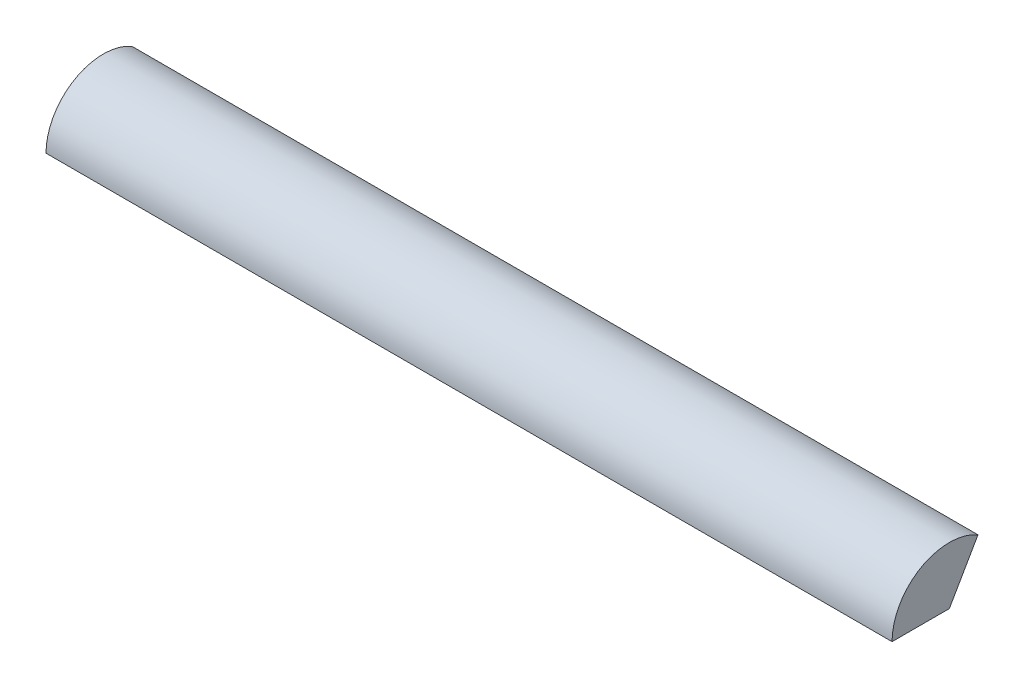
ISO-10303-21;
HEADER;
FILE_DESCRIPTION(('STEP AP214'),'2;1');
FILE_NAME('part.step','',(''),(''),'','','');
FILE_SCHEMA(('AUTOMOTIVE_DESIGN { 1 0 10303 214 1 1 1 1 }'));
ENDSEC;
DATA;
#1=APPLICATION_CONTEXT('core data for automotive mechanical design processes');
#2=APPLICATION_PROTOCOL_DEFINITION('international standard','automotive_design',2000,#1);
#3=PRODUCT_CONTEXT('',#1,'mechanical');
#4=PRODUCT('Part','Part','',(#3));
#5=PRODUCT_RELATED_PRODUCT_CATEGORY('part','',(#4));
#6=PRODUCT_DEFINITION_FORMATION('','',#4);
#7=PRODUCT_DEFINITION_CONTEXT('part definition',#1,'design');
#8=PRODUCT_DEFINITION('design','',#6,#7);
#9=PRODUCT_DEFINITION_SHAPE('','',#8);
#10=(LENGTH_UNIT() NAMED_UNIT(*) SI_UNIT(.MILLI.,.METRE.));
#11=(NAMED_UNIT(*) PLANE_ANGLE_UNIT() SI_UNIT($,.RADIAN.));
#12=(NAMED_UNIT(*) SI_UNIT($,.STERADIAN.) SOLID_ANGLE_UNIT());
#13=UNCERTAINTY_MEASURE_WITH_UNIT(LENGTH_MEASURE(1.E-05),#10,'distance_accuracy_value','');
#14=(GEOMETRIC_REPRESENTATION_CONTEXT(3) GLOBAL_UNCERTAINTY_ASSIGNED_CONTEXT((#13)) GLOBAL_UNIT_ASSIGNED_CONTEXT((#10,
#11,#12)) REPRESENTATION_CONTEXT('',''));
#15=CARTESIAN_POINT('',(0.,0.,0.));
#16=DIRECTION('',(0.,0.,1.));
#17=DIRECTION('',(1.,0.,0.));
#18=AXIS2_PLACEMENT_3D('',#15,#16,#17);
#19=CARTESIAN_POINT('',(0.,0.,0.));
#20=DIRECTION('',(1.,0.,0.));
#21=DIRECTION('',(0.,0.,-1.));
#22=AXIS2_PLACEMENT_3D('',#19,#20,#21);
#23=CYLINDRICAL_SURFACE('',#22,27.5);
#24=CARTESIAN_POINT('',(-520.7,0.,0.));
#25=DIRECTION('',(1.,0.,0.));
#26=DIRECTION('',(0.,0.,-1.));
#27=AXIS2_PLACEMENT_3D('',#24,#25,#26);
#28=CIRCLE('',#27,27.5);
#29=CARTESIAN_POINT('',(-520.7,23.815698604072,-13.75));
#30=VERTEX_POINT('',#29);
#31=CARTESIAN_POINT('',(-520.7,0.,27.5000000000001));
#32=VERTEX_POINT('',#31);
#33=EDGE_CURVE('E11',#30,#32,#28,.T.);
#34=ORIENTED_EDGE('',*,*,#33,.F.);
#35=DIRECTION('',(1.,0.,0.));
#36=VECTOR('',#35,1.);
#37=CARTESIAN_POINT('',(0.,23.8156986040721,-13.7500000000001));
#38=LINE('',#37,#36);
#39=CARTESIAN_POINT('',(-170.7,23.815698604072,-13.7500000000001));
#40=VERTEX_POINT('',#39);
#41=EDGE_CURVE('E134',#30,#40,#38,.T.);
#42=ORIENTED_EDGE('',*,*,#41,.T.);
#43=CARTESIAN_POINT('',(-170.7,0.,0.));
#44=DIRECTION('',(1.,0.,0.));
#45=DIRECTION('',(0.,0.,-1.));
#46=AXIS2_PLACEMENT_3D('',#43,#44,#45);
#47=CIRCLE('',#46,27.5000000000001);
#48=CARTESIAN_POINT('',(-170.7,0.,27.5000000000001));
#49=VERTEX_POINT('',#48);
#50=EDGE_CURVE('E54',#40,#49,#47,.T.);
#51=ORIENTED_EDGE('',*,*,#50,.T.);
#52=DIRECTION('',(1.,0.,0.));
#53=VECTOR('',#52,1.);
#54=CARTESIAN_POINT('',(0.,0.,27.5000000000001));
#55=LINE('',#54,#53);
#56=EDGE_CURVE('E109',#32,#49,#55,.T.);
#57=ORIENTED_EDGE('',*,*,#56,.F.);
#58=EDGE_LOOP('',(#34,#42,#51,#57));
#59=FACE_BOUND('',#58,.T.);
#60=ADVANCED_FACE('F39',(#59),#23,.F.);
#61=CARTESIAN_POINT('',(-520.7,23.815698604072,-13.75));
#62=CARTESIAN_POINT('',(-596.9,23.815698604072,-13.75));
#63=CARTESIAN_POINT('',(-596.9,0.,0.));
#64=B_SPLINE_CURVE_WITH_KNOTS('',2,(#61,#62,#63),.UNSPECIFIED.,.F.,.F.,(3,3),(0.,1.),.UNSPECIFIED.);
#65=CARTESIAN_POINT('',(0.,0.,0.));
#66=DIRECTION('',(1.,0.,0.));
#67=AXIS1_PLACEMENT('',#65,#66);
#68=SURFACE_OF_REVOLUTION('',#64,#67);
#69=CARTESIAN_POINT('',(-520.7,0.,27.5000000000001));
#70=CARTESIAN_POINT('',(-596.9,0.,27.5000000000001));
#71=CARTESIAN_POINT('',(-596.9,0.,0.));
#72=B_SPLINE_CURVE_WITH_KNOTS('',2,(#69,#70,#71),.UNSPECIFIED.,.F.,.F.,(3,3),(0.,1.),.UNSPECIFIED.);
#73=CARTESIAN_POINT('',(-596.9,0.,0.));
#74=VERTEX_POINT('',#73);
#75=EDGE_CURVE('E105',#32,#74,#72,.T.);
#76=ORIENTED_EDGE('',*,*,#75,.T.);
#77=EDGE_CURVE('E101',#30,#74,#64,.T.);
#78=ORIENTED_EDGE('',*,*,#77,.F.);
#79=ORIENTED_EDGE('',*,*,#33,.T.);
#80=EDGE_LOOP('',(#76,#78,#79));
#81=FACE_BOUND('',#80,.T.);
#82=ADVANCED_FACE('F41',(#81),#68,.T.);
#83=CARTESIAN_POINT('',(-609.6,0.,1.11981703314034E-13));
#84=DIRECTION('',(1.,0.,0.));
#85=DIRECTION('',(0.,0.,-1.));
#86=AXIS2_PLACEMENT_3D('',#83,#84,#85);
#87=PLANE('',#86);
#88=CARTESIAN_POINT('',(-609.6,0.,0.));
#89=DIRECTION('',(1.,0.,0.));
#90=DIRECTION('',(0.,0.,-1.));
#91=AXIS2_PLACEMENT_3D('',#88,#89,#90);
#92=CIRCLE('',#91,41.275);
#93=CARTESIAN_POINT('',(-609.6,35.7451985412026,-20.6375000000001));
#94=VERTEX_POINT('',#93);
#95=CARTESIAN_POINT('',(-609.6,0.,41.2750000000001));
#96=VERTEX_POINT('',#95);
#97=EDGE_CURVE('E48',#94,#96,#92,.T.);
#98=ORIENTED_EDGE('',*,*,#97,.F.);
#99=DIRECTION('',(0.,0.866025403784436,-0.500000000000004));
#100=VECTOR('',#99,1.);
#101=CARTESIAN_POINT('',(-609.6,0.,1.11981703314034E-13));
#102=LINE('',#101,#100);
#103=CARTESIAN_POINT('',(-609.6,0.,0.));
#104=VERTEX_POINT('',#103);
#105=EDGE_CURVE('E143',#104,#94,#102,.T.);
#106=ORIENTED_EDGE('',*,*,#105,.F.);
#107=DIRECTION('',(0.,0.,1.));
#108=VECTOR('',#107,1.);
#109=CARTESIAN_POINT('',(-609.6,0.,0.));
#110=LINE('',#109,#108);
#111=EDGE_CURVE('E113',#104,#96,#110,.T.);
#112=ORIENTED_EDGE('',*,*,#111,.T.);
#113=EDGE_LOOP('',(#98,#106,#112));
#114=FACE_BOUND('',#113,.T.);
#115=ADVANCED_FACE('F166',(#114),#87,.F.);
#116=CARTESIAN_POINT('',(0.,0.,0.));
#117=DIRECTION('',(1.,0.,0.));
#118=DIRECTION('',(0.,0.,-1.));
#119=AXIS2_PLACEMENT_3D('',#116,#117,#118);
#120=CYLINDRICAL_SURFACE('',#119,41.275);
#121=CARTESIAN_POINT('',(0.,0.,0.));
#122=DIRECTION('',(1.,0.,0.));
#123=DIRECTION('',(0.,0.,-1.));
#124=AXIS2_PLACEMENT_3D('',#121,#122,#123);
#125=CIRCLE('',#124,41.275);
#126=CARTESIAN_POINT('',(0.,35.7451985412026,-20.6375000000002));
#127=VERTEX_POINT('',#126);
#128=CARTESIAN_POINT('',(0.,0.,41.275));
#129=VERTEX_POINT('',#128);
#130=EDGE_CURVE('E161',#127,#129,#125,.T.);
#131=ORIENTED_EDGE('',*,*,#130,.F.);
#132=DIRECTION('',(-1.,0.,0.));
#133=VECTOR('',#132,1.);
#134=CARTESIAN_POINT('',(0.,35.7451985412026,-20.6375000000002));
#135=LINE('',#134,#133);
#136=EDGE_CURVE('E149',#127,#94,#135,.T.);
#137=ORIENTED_EDGE('',*,*,#136,.T.);
#138=ORIENTED_EDGE('',*,*,#97,.T.);
#139=DIRECTION('',(-1.,0.,0.));
#140=VECTOR('',#139,1.);
#141=CARTESIAN_POINT('',(0.,0.,41.275));
#142=LINE('',#141,#140);
#143=EDGE_CURVE('E119',#129,#96,#142,.T.);
#144=ORIENTED_EDGE('',*,*,#143,.F.);
#145=EDGE_LOOP('',(#131,#137,#138,#144));
#146=FACE_BOUND('',#145,.T.);
#147=ADVANCED_FACE('F163',(#146),#120,.T.);
#148=CARTESIAN_POINT('',(0.,0.,0.));
#149=DIRECTION('',(1.,0.,0.));
#150=DIRECTION('',(0.,0.,-1.));
#151=AXIS2_PLACEMENT_3D('',#148,#149,#150);
#152=PLANE('',#151);
#153=DIRECTION('',(0.,0.,1.));
#154=VECTOR('',#153,1.);
#155=CARTESIAN_POINT('',(0.,0.,0.));
#156=LINE('',#155,#154);
#157=CARTESIAN_POINT('',(0.,0.,0.));
#158=VERTEX_POINT('',#157);
#159=EDGE_CURVE('E126',#158,#129,#156,.T.);
#160=ORIENTED_EDGE('',*,*,#159,.F.);
#161=DIRECTION('',(0.,0.866025403784436,-0.500000000000004));
#162=VECTOR('',#161,1.);
#163=CARTESIAN_POINT('',(0.,0.,0.));
#164=LINE('',#163,#162);
#165=EDGE_CURVE('E151',#158,#127,#164,.T.);
#166=ORIENTED_EDGE('',*,*,#165,.T.);
#167=ORIENTED_EDGE('',*,*,#130,.T.);
#168=EDGE_LOOP('',(#160,#166,#167));
#169=FACE_BOUND('',#168,.T.);
#170=ADVANCED_FACE('F171',(#169),#152,.T.);
#171=CARTESIAN_POINT('',(-20.7,0.,0.));
#172=DIRECTION('',(1.,0.,0.));
#173=DIRECTION('',(0.,0.,-1.));
#174=AXIS2_PLACEMENT_3D('',#171,#172,#173);
#175=PLANE('',#174);
#176=CARTESIAN_POINT('',(-20.7,0.,0.));
#177=DIRECTION('',(1.,0.,0.));
#178=DIRECTION('',(0.,0.,-1.));
#179=AXIS2_PLACEMENT_3D('',#176,#177,#178);
#180=CIRCLE('',#179,5.);
#181=CARTESIAN_POINT('',(-20.7,4.33012701892218,-2.50000000000002));
#182=VERTEX_POINT('',#181);
#183=CARTESIAN_POINT('',(-20.7,0.,5.));
#184=VERTEX_POINT('',#183);
#185=EDGE_CURVE('E64',#182,#184,#180,.T.);
#186=ORIENTED_EDGE('',*,*,#185,.F.);
#187=DIRECTION('',(0.,0.866025403784436,-0.500000000000004));
#188=VECTOR('',#187,1.);
#189=CARTESIAN_POINT('',(-20.7,0.,0.));
#190=LINE('',#189,#188);
#191=CARTESIAN_POINT('',(-20.7,0.,0.));
#192=VERTEX_POINT('',#191);
#193=EDGE_CURVE('E153',#192,#182,#190,.T.);
#194=ORIENTED_EDGE('',*,*,#193,.F.);
#195=DIRECTION('',(0.,0.,1.));
#196=VECTOR('',#195,1.);
#197=CARTESIAN_POINT('',(-20.7,0.,0.));
#198=LINE('',#197,#196);
#199=EDGE_CURVE('E131',#192,#184,#198,.T.);
#200=ORIENTED_EDGE('',*,*,#199,.T.);
#201=EDGE_LOOP('',(#186,#194,#200));
#202=FACE_BOUND('',#201,.T.);
#203=ADVANCED_FACE('F180',(#202),#175,.F.);
#204=CARTESIAN_POINT('',(-20.7,0.,0.));
#205=DIRECTION('',(-1.,0.,0.));
#206=DIRECTION('',(0.,0.,1.));
#207=AXIS2_PLACEMENT_3D('',#204,#205,#206);
#208=CONICAL_SURFACE('',#207,5.,0.148889947609498);
#209=DIRECTION('',(-0.988936352868298,0.128466600646482,-0.074170226465123));
#210=VECTOR('',#209,1.);
#211=CARTESIAN_POINT('',(0.27799511002445,1.60500551606015,-0.926650366748173));
#212=LINE('',#211,#210);
#213=EDGE_CURVE('E157',#182,#40,#212,.T.);
#214=ORIENTED_EDGE('',*,*,#213,.F.);
#215=ORIENTED_EDGE('',*,*,#185,.T.);
#216=DIRECTION('',(-0.988936352868298,0.,0.148340452930245));
#217=VECTOR('',#216,1.);
#218=CARTESIAN_POINT('',(0.27799511002445,0.,1.85330073349633));
#219=LINE('',#218,#217);
#220=EDGE_CURVE('E133',#184,#49,#219,.T.);
#221=ORIENTED_EDGE('',*,*,#220,.T.);
#222=ORIENTED_EDGE('',*,*,#50,.F.);
#223=EDGE_LOOP('',(#214,#215,#221,#222));
#224=FACE_BOUND('',#223,.T.);
#225=ADVANCED_FACE('F176',(#224),#208,.F.);
#226=CARTESIAN_POINT('',(0.,0.,0.));
#227=DIRECTION('',(0.,-0.500000000000004,-0.866025403784436));
#228=DIRECTION('',(0.,0.866025403784436,-0.500000000000004));
#229=AXIS2_PLACEMENT_3D('',#226,#227,#228);
#230=PLANE('',#229);
#231=ORIENTED_EDGE('',*,*,#41,.F.);
#232=ORIENTED_EDGE('',*,*,#77,.T.);
#233=DIRECTION('',(-1.,0.,0.));
#234=VECTOR('',#233,1.);
#235=CARTESIAN_POINT('',(0.,0.,0.));
#236=LINE('',#235,#234);
#237=EDGE_CURVE('E114',#74,#104,#236,.T.);
#238=ORIENTED_EDGE('',*,*,#237,.T.);
#239=ORIENTED_EDGE('',*,*,#105,.T.);
#240=ORIENTED_EDGE('',*,*,#136,.F.);
#241=ORIENTED_EDGE('',*,*,#165,.F.);
#242=EDGE_CURVE('E144',#158,#192,#236,.T.);
#243=ORIENTED_EDGE('',*,*,#242,.T.);
#244=ORIENTED_EDGE('',*,*,#193,.T.);
#245=ORIENTED_EDGE('',*,*,#213,.T.);
#246=EDGE_LOOP('',(#231,#232,#238,#239,#240,#241,#243,#244,#245));
#247=FACE_BOUND('',#246,.T.);
#248=ADVANCED_FACE('F172',(#247),#230,.T.);
#249=CARTESIAN_POINT('',(0.,0.,0.));
#250=DIRECTION('',(0.,1.,0.));
#251=DIRECTION('',(0.,0.,1.));
#252=AXIS2_PLACEMENT_3D('',#249,#250,#251);
#253=PLANE('',#252);
#254=ORIENTED_EDGE('',*,*,#56,.T.);
#255=ORIENTED_EDGE('',*,*,#220,.F.);
#256=ORIENTED_EDGE('',*,*,#199,.F.);
#257=ORIENTED_EDGE('',*,*,#242,.F.);
#258=ORIENTED_EDGE('',*,*,#159,.T.);
#259=ORIENTED_EDGE('',*,*,#143,.T.);
#260=ORIENTED_EDGE('',*,*,#111,.F.);
#261=ORIENTED_EDGE('',*,*,#237,.F.);
#262=ORIENTED_EDGE('',*,*,#75,.F.);
#263=EDGE_LOOP('',(#254,#255,#256,#257,#258,#259,#260,#261,#262));
#264=FACE_BOUND('',#263,.T.);
#265=ADVANCED_FACE('F115',(#264),#253,.F.);
#266=CLOSED_SHELL('',(#60,#82,#115,#147,#170,#203,#225,#248,#265));
#267=MANIFOLD_SOLID_BREP('B2',#266);
#268=ADVANCED_BREP_SHAPE_REPRESENTATION('',(#18,#267),#14);
#269=SHAPE_DEFINITION_REPRESENTATION(#9,#268);
ENDSEC;
END-ISO-10303-21;
